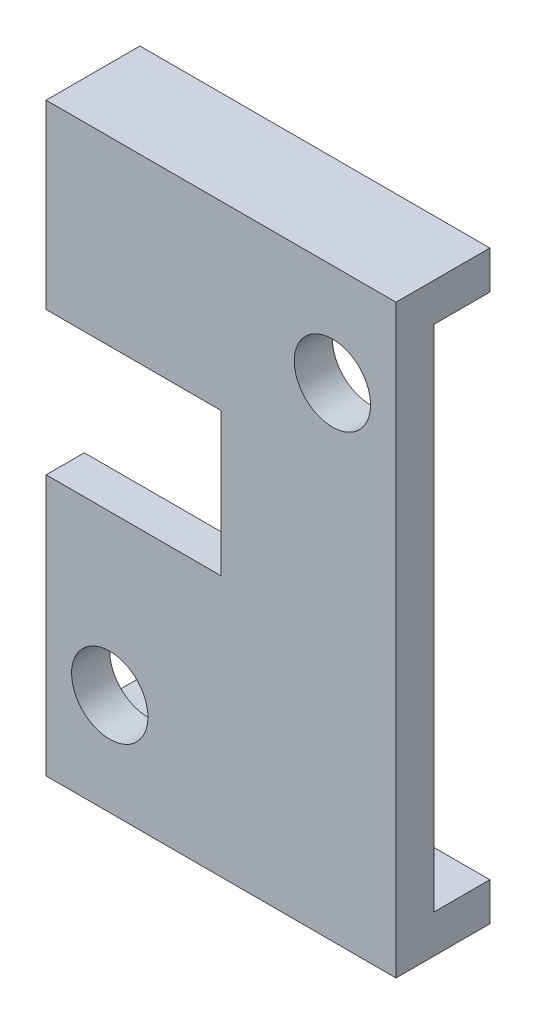
ISO-10303-21;
HEADER;
FILE_DESCRIPTION(('STEP AP214'),'2;1');
FILE_NAME('part.step','',(''),(''),'','','');
FILE_SCHEMA(('AUTOMOTIVE_DESIGN { 1 0 10303 214 1 1 1 1 }'));
ENDSEC;
DATA;
#1=APPLICATION_CONTEXT('core data for automotive mechanical design processes');
#2=APPLICATION_PROTOCOL_DEFINITION('international standard','automotive_design',2000,#1);
#3=PRODUCT_CONTEXT('',#1,'mechanical');
#4=PRODUCT('Part','Part','',(#3));
#5=PRODUCT_RELATED_PRODUCT_CATEGORY('part','',(#4));
#6=PRODUCT_DEFINITION_FORMATION('','',#4);
#7=PRODUCT_DEFINITION_CONTEXT('part definition',#1,'design');
#8=PRODUCT_DEFINITION('design','',#6,#7);
#9=PRODUCT_DEFINITION_SHAPE('','',#8);
#10=(LENGTH_UNIT() NAMED_UNIT(*) SI_UNIT(.MILLI.,.METRE.));
#11=(NAMED_UNIT(*) PLANE_ANGLE_UNIT() SI_UNIT($,.RADIAN.));
#12=(NAMED_UNIT(*) SI_UNIT($,.STERADIAN.) SOLID_ANGLE_UNIT());
#13=UNCERTAINTY_MEASURE_WITH_UNIT(LENGTH_MEASURE(1.E-05),#10,'distance_accuracy_value','');
#14=(GEOMETRIC_REPRESENTATION_CONTEXT(3) GLOBAL_UNCERTAINTY_ASSIGNED_CONTEXT((#13)) GLOBAL_UNIT_ASSIGNED_CONTEXT((#10,
#11,#12)) REPRESENTATION_CONTEXT('',''));
#15=CARTESIAN_POINT('',(0.,0.,0.));
#16=DIRECTION('',(0.,0.,1.));
#17=DIRECTION('',(1.,0.,0.));
#18=AXIS2_PLACEMENT_3D('',#15,#16,#17);
#19=CARTESIAN_POINT('',(0.,0.,0.));
#20=DIRECTION('',(-1.,0.,0.));
#21=DIRECTION('',(0.,0.,1.));
#22=AXIS2_PLACEMENT_3D('',#19,#20,#21);
#23=PLANE('',#22);
#24=DIRECTION('',(0.,0.,-1.));
#25=VECTOR('',#24,1.);
#26=CARTESIAN_POINT('',(0.,8.2,2.95));
#27=LINE('',#26,#25);
#28=CARTESIAN_POINT('',(0.,8.2,2.95));
#29=VERTEX_POINT('',#28);
#30=CARTESIAN_POINT('',(0.,8.2,1.74999999999999));
#31=VERTEX_POINT('',#30);
#32=EDGE_CURVE('E210',#29,#31,#27,.T.);
#33=ORIENTED_EDGE('',*,*,#32,.T.);
#34=DIRECTION('',(0.,1.,0.));
#35=VECTOR('',#34,1.);
#36=CARTESIAN_POINT('',(0.,17.2,1.75));
#37=LINE('',#36,#35);
#38=CARTESIAN_POINT('',(0.,1.2,1.74999999999999));
#39=VERTEX_POINT('',#38);
#40=EDGE_CURVE('E164',#39,#31,#37,.T.);
#41=ORIENTED_EDGE('',*,*,#40,.F.);
#42=DIRECTION('',(0.,0.,1.));
#43=VECTOR('',#42,1.);
#44=CARTESIAN_POINT('',(0.,1.2,1.74999999999999));
#45=LINE('',#44,#43);
#46=CARTESIAN_POINT('',(0.,1.20000000000001,0.));
#47=VERTEX_POINT('',#46);
#48=EDGE_CURVE('E159',#47,#39,#45,.T.);
#49=ORIENTED_EDGE('',*,*,#48,.F.);
#50=DIRECTION('',(0.,1.,0.));
#51=VECTOR('',#50,1.);
#52=CARTESIAN_POINT('',(0.,1.20000000000001,0.));
#53=LINE('',#52,#51);
#54=CARTESIAN_POINT('',(0.,0.,0.));
#55=VERTEX_POINT('',#54);
#56=EDGE_CURVE('E155',#55,#47,#53,.T.);
#57=ORIENTED_EDGE('',*,*,#56,.F.);
#58=DIRECTION('',(0.,0.,-1.));
#59=VECTOR('',#58,1.);
#60=CARTESIAN_POINT('',(0.,0.,0.));
#61=LINE('',#60,#59);
#62=CARTESIAN_POINT('',(0.,0.,2.94999999999999));
#63=VERTEX_POINT('',#62);
#64=EDGE_CURVE('E97',#63,#55,#61,.T.);
#65=ORIENTED_EDGE('',*,*,#64,.F.);
#66=DIRECTION('',(0.,-1.,0.));
#67=VECTOR('',#66,1.);
#68=CARTESIAN_POINT('',(0.,0.,2.94999999999999));
#69=LINE('',#68,#67);
#70=EDGE_CURVE('E176',#29,#63,#69,.T.);
#71=ORIENTED_EDGE('',*,*,#70,.F.);
#72=EDGE_LOOP('',(#33,#41,#49,#57,#65,#71));
#73=FACE_BOUND('',#72,.T.);
#74=ADVANCED_FACE('F39',(#73),#23,.T.);
#75=CARTESIAN_POINT('',(11.,1.20000000000001,0.));
#76=DIRECTION('',(0.,0.,1.));
#77=DIRECTION('',(0.,-1.,0.));
#78=AXIS2_PLACEMENT_3D('',#75,#76,#77);
#79=PLANE('',#78);
#80=ORIENTED_EDGE('',*,*,#56,.T.);
#81=DIRECTION('',(-1.,0.,0.));
#82=VECTOR('',#81,1.);
#83=CARTESIAN_POINT('',(11.,1.20000000000001,0.));
#84=LINE('',#83,#82);
#85=CARTESIAN_POINT('',(11.,1.20000000000001,0.));
#86=VERTEX_POINT('',#85);
#87=EDGE_CURVE('E11',#86,#47,#84,.T.);
#88=ORIENTED_EDGE('',*,*,#87,.F.);
#89=DIRECTION('',(0.,1.,0.));
#90=VECTOR('',#89,1.);
#91=CARTESIAN_POINT('',(11.,1.20000000000001,0.));
#92=LINE('',#91,#90);
#93=CARTESIAN_POINT('',(11.,0.,0.));
#94=VERTEX_POINT('',#93);
#95=EDGE_CURVE('E182',#94,#86,#92,.T.);
#96=ORIENTED_EDGE('',*,*,#95,.F.);
#97=DIRECTION('',(-1.,0.,0.));
#98=VECTOR('',#97,1.);
#99=CARTESIAN_POINT('',(11.,0.,0.));
#100=LINE('',#99,#98);
#101=EDGE_CURVE('E151',#94,#55,#100,.T.);
#102=ORIENTED_EDGE('',*,*,#101,.T.);
#103=EDGE_LOOP('',(#80,#88,#96,#102));
#104=FACE_BOUND('',#103,.T.);
#105=ADVANCED_FACE('F41',(#104),#79,.F.);
#106=CARTESIAN_POINT('',(11.,1.2,1.74999999999999));
#107=DIRECTION('',(0.,-1.,0.));
#108=DIRECTION('',(0.,0.,-1.));
#109=AXIS2_PLACEMENT_3D('',#106,#107,#108);
#110=PLANE('',#109);
#111=ORIENTED_EDGE('',*,*,#48,.T.);
#112=DIRECTION('',(-1.,0.,0.));
#113=VECTOR('',#112,1.);
#114=CARTESIAN_POINT('',(11.,1.2,1.74999999999999));
#115=LINE('',#114,#113);
#116=CARTESIAN_POINT('',(11.,1.2,1.74999999999999));
#117=VERTEX_POINT('',#116);
#118=EDGE_CURVE('E48',#117,#39,#115,.T.);
#119=ORIENTED_EDGE('',*,*,#118,.F.);
#120=DIRECTION('',(0.,0.,1.));
#121=VECTOR('',#120,1.);
#122=CARTESIAN_POINT('',(11.,1.2,1.74999999999999));
#123=LINE('',#122,#121);
#124=EDGE_CURVE('E105',#86,#117,#123,.T.);
#125=ORIENTED_EDGE('',*,*,#124,.F.);
#126=ORIENTED_EDGE('',*,*,#87,.T.);
#127=EDGE_LOOP('',(#111,#119,#125,#126));
#128=FACE_BOUND('',#127,.T.);
#129=ADVANCED_FACE('F318',(#128),#110,.F.);
#130=CARTESIAN_POINT('',(11.,17.2,1.75));
#131=DIRECTION('',(0.,0.,1.));
#132=DIRECTION('',(0.,-1.,0.));
#133=AXIS2_PLACEMENT_3D('',#130,#131,#132);
#134=PLANE('',#133);
#135=CARTESIAN_POINT('',(9.,15.2,1.75));
#136=DIRECTION('',(0.,0.,-1.));
#137=DIRECTION('',(0.,1.,0.));
#138=AXIS2_PLACEMENT_3D('',#135,#136,#137);
#139=CIRCLE('',#138,1.2);
#140=CARTESIAN_POINT('',(9.,16.4,1.75));
#141=VERTEX_POINT('',#140);
#142=EDGE_CURVE('E254',#141,#141,#139,.T.);
#143=ORIENTED_EDGE('',*,*,#142,.F.);
#144=EDGE_LOOP('',(#143));
#145=FACE_BOUND('',#144,.T.);
#146=CARTESIAN_POINT('',(2.,3.2,1.74999999999999));
#147=DIRECTION('',(0.,0.,-1.));
#148=DIRECTION('',(0.,1.,0.));
#149=AXIS2_PLACEMENT_3D('',#146,#147,#148);
#150=CIRCLE('',#149,1.2);
#151=CARTESIAN_POINT('',(2.,4.4,1.74999999999999));
#152=VERTEX_POINT('',#151);
#153=EDGE_CURVE('E218',#152,#152,#150,.T.);
#154=ORIENTED_EDGE('',*,*,#153,.F.);
#155=EDGE_LOOP('',(#154));
#156=FACE_BOUND('',#155,.T.);
#157=ORIENTED_EDGE('',*,*,#40,.T.);
#158=DIRECTION('',(-1.,0.,0.));
#159=VECTOR('',#158,1.);
#160=CARTESIAN_POINT('',(0.,8.2,1.74999999999999));
#161=LINE('',#160,#159);
#162=CARTESIAN_POINT('',(5.5,8.2,1.74999999999999));
#163=VERTEX_POINT('',#162);
#164=EDGE_CURVE('E230',#163,#31,#161,.T.);
#165=ORIENTED_EDGE('',*,*,#164,.F.);
#166=DIRECTION('',(0.,-1.,0.));
#167=VECTOR('',#166,1.);
#168=CARTESIAN_POINT('',(5.5,12.7,1.75));
#169=LINE('',#168,#167);
#170=CARTESIAN_POINT('',(5.5,12.7,1.75));
#171=VERTEX_POINT('',#170);
#172=EDGE_CURVE('E274',#171,#163,#169,.T.);
#173=ORIENTED_EDGE('',*,*,#172,.F.);
#174=DIRECTION('',(1.,0.,0.));
#175=VECTOR('',#174,1.);
#176=CARTESIAN_POINT('',(0.,12.7,1.75));
#177=LINE('',#176,#175);
#178=CARTESIAN_POINT('',(0.,12.7,1.75));
#179=VERTEX_POINT('',#178);
#180=EDGE_CURVE('E271',#179,#171,#177,.T.);
#181=ORIENTED_EDGE('',*,*,#180,.F.);
#182=CARTESIAN_POINT('',(0.,17.2,1.75));
#183=VERTEX_POINT('',#182);
#184=EDGE_CURVE('E163',#179,#183,#37,.T.);
#185=ORIENTED_EDGE('',*,*,#184,.T.);
#186=DIRECTION('',(-1.,0.,0.));
#187=VECTOR('',#186,1.);
#188=CARTESIAN_POINT('',(11.,17.2,1.75));
#189=LINE('',#188,#187);
#190=CARTESIAN_POINT('',(11.,17.2,1.75));
#191=VERTEX_POINT('',#190);
#192=EDGE_CURVE('E193',#191,#183,#189,.T.);
#193=ORIENTED_EDGE('',*,*,#192,.F.);
#194=DIRECTION('',(0.,1.,0.));
#195=VECTOR('',#194,1.);
#196=CARTESIAN_POINT('',(11.,17.2,1.75));
#197=LINE('',#196,#195);
#198=EDGE_CURVE('E204',#117,#191,#197,.T.);
#199=ORIENTED_EDGE('',*,*,#198,.F.);
#200=ORIENTED_EDGE('',*,*,#118,.T.);
#201=EDGE_LOOP('',(#157,#165,#173,#181,#185,#193,#199,#200));
#202=FACE_BOUND('',#201,.T.);
#203=ADVANCED_FACE('F201',(#145,#156,#202),#134,.F.);
#204=CARTESIAN_POINT('',(11.,17.2,0.));
#205=DIRECTION('',(0.,1.,0.));
#206=DIRECTION('',(0.,0.,1.));
#207=AXIS2_PLACEMENT_3D('',#204,#205,#206);
#208=PLANE('',#207);
#209=DIRECTION('',(0.,0.,-1.));
#210=VECTOR('',#209,1.);
#211=CARTESIAN_POINT('',(0.,17.2,0.));
#212=LINE('',#211,#210);
#213=CARTESIAN_POINT('',(0.,17.2,0.));
#214=VERTEX_POINT('',#213);
#215=EDGE_CURVE('E168',#183,#214,#212,.T.);
#216=ORIENTED_EDGE('',*,*,#215,.T.);
#217=DIRECTION('',(-1.,0.,0.));
#218=VECTOR('',#217,1.);
#219=CARTESIAN_POINT('',(11.,17.2,0.));
#220=LINE('',#219,#218);
#221=CARTESIAN_POINT('',(11.,17.2,0.));
#222=VERTEX_POINT('',#221);
#223=EDGE_CURVE('E189',#222,#214,#220,.T.);
#224=ORIENTED_EDGE('',*,*,#223,.F.);
#225=DIRECTION('',(0.,0.,-1.));
#226=VECTOR('',#225,1.);
#227=CARTESIAN_POINT('',(11.,17.2,0.));
#228=LINE('',#227,#226);
#229=EDGE_CURVE('E246',#191,#222,#228,.T.);
#230=ORIENTED_EDGE('',*,*,#229,.F.);
#231=ORIENTED_EDGE('',*,*,#192,.T.);
#232=EDGE_LOOP('',(#216,#224,#230,#231));
#233=FACE_BOUND('',#232,.T.);
#234=ADVANCED_FACE('F301',(#233),#208,.F.);
#235=CARTESIAN_POINT('',(11.,18.4,0.));
#236=DIRECTION('',(0.,0.,1.));
#237=DIRECTION('',(0.,-1.,0.));
#238=AXIS2_PLACEMENT_3D('',#235,#236,#237);
#239=PLANE('',#238);
#240=DIRECTION('',(0.,1.,0.));
#241=VECTOR('',#240,1.);
#242=CARTESIAN_POINT('',(0.,18.4,0.));
#243=LINE('',#242,#241);
#244=CARTESIAN_POINT('',(0.,18.4,0.));
#245=VERTEX_POINT('',#244);
#246=EDGE_CURVE('E171',#214,#245,#243,.T.);
#247=ORIENTED_EDGE('',*,*,#246,.T.);
#248=DIRECTION('',(-1.,0.,0.));
#249=VECTOR('',#248,1.);
#250=CARTESIAN_POINT('',(11.,18.4,0.));
#251=LINE('',#250,#249);
#252=CARTESIAN_POINT('',(11.,18.4,0.));
#253=VERTEX_POINT('',#252);
#254=EDGE_CURVE('E143',#253,#245,#251,.T.);
#255=ORIENTED_EDGE('',*,*,#254,.F.);
#256=DIRECTION('',(0.,1.,0.));
#257=VECTOR('',#256,1.);
#258=CARTESIAN_POINT('',(11.,18.4,0.));
#259=LINE('',#258,#257);
#260=EDGE_CURVE('E128',#222,#253,#259,.T.);
#261=ORIENTED_EDGE('',*,*,#260,.F.);
#262=ORIENTED_EDGE('',*,*,#223,.T.);
#263=EDGE_LOOP('',(#247,#255,#261,#262));
#264=FACE_BOUND('',#263,.T.);
#265=ADVANCED_FACE('F304',(#264),#239,.F.);
#266=CARTESIAN_POINT('',(11.,18.4,2.94999999999999));
#267=DIRECTION('',(0.,-1.,0.));
#268=DIRECTION('',(0.,0.,-1.));
#269=AXIS2_PLACEMENT_3D('',#266,#267,#268);
#270=PLANE('',#269);
#271=DIRECTION('',(0.,0.,1.));
#272=VECTOR('',#271,1.);
#273=CARTESIAN_POINT('',(0.,18.4,2.94999999999999));
#274=LINE('',#273,#272);
#275=CARTESIAN_POINT('',(0.,18.4,2.94999999999999));
#276=VERTEX_POINT('',#275);
#277=EDGE_CURVE('E138',#245,#276,#274,.T.);
#278=ORIENTED_EDGE('',*,*,#277,.T.);
#279=DIRECTION('',(-1.,0.,0.));
#280=VECTOR('',#279,1.);
#281=CARTESIAN_POINT('',(11.,18.4,2.94999999999999));
#282=LINE('',#281,#280);
#283=CARTESIAN_POINT('',(11.,18.4,2.94999999999999));
#284=VERTEX_POINT('',#283);
#285=EDGE_CURVE('E135',#284,#276,#282,.T.);
#286=ORIENTED_EDGE('',*,*,#285,.F.);
#287=DIRECTION('',(0.,0.,1.));
#288=VECTOR('',#287,1.);
#289=CARTESIAN_POINT('',(11.,18.4,2.94999999999999));
#290=LINE('',#289,#288);
#291=EDGE_CURVE('E121',#253,#284,#290,.T.);
#292=ORIENTED_EDGE('',*,*,#291,.F.);
#293=ORIENTED_EDGE('',*,*,#254,.T.);
#294=EDGE_LOOP('',(#278,#286,#292,#293));
#295=FACE_BOUND('',#294,.T.);
#296=ADVANCED_FACE('F136',(#295),#270,.F.);
#297=CARTESIAN_POINT('',(11.,0.,2.94999999999999));
#298=DIRECTION('',(0.,0.,-1.));
#299=DIRECTION('',(0.,1.,0.));
#300=AXIS2_PLACEMENT_3D('',#297,#298,#299);
#301=PLANE('',#300);
#302=CARTESIAN_POINT('',(9.,15.2,2.95));
#303=DIRECTION('',(0.,0.,-1.));
#304=DIRECTION('',(0.,1.,0.));
#305=AXIS2_PLACEMENT_3D('',#302,#303,#304);
#306=CIRCLE('',#305,1.2);
#307=CARTESIAN_POINT('',(9.,16.4,2.95));
#308=VERTEX_POINT('',#307);
#309=EDGE_CURVE('E160',#308,#308,#306,.T.);
#310=ORIENTED_EDGE('',*,*,#309,.T.);
#311=EDGE_LOOP('',(#310));
#312=FACE_BOUND('',#311,.T.);
#313=CARTESIAN_POINT('',(2.,3.2,2.94999999999999));
#314=DIRECTION('',(0.,0.,-1.));
#315=DIRECTION('',(0.,1.,0.));
#316=AXIS2_PLACEMENT_3D('',#313,#314,#315);
#317=CIRCLE('',#316,1.2);
#318=CARTESIAN_POINT('',(2.,4.4,2.94999999999999));
#319=VERTEX_POINT('',#318);
#320=EDGE_CURVE('E224',#319,#319,#317,.T.);
#321=ORIENTED_EDGE('',*,*,#320,.T.);
#322=EDGE_LOOP('',(#321));
#323=FACE_BOUND('',#322,.T.);
#324=DIRECTION('',(0.,-1.,0.));
#325=VECTOR('',#324,1.);
#326=CARTESIAN_POINT('',(5.5,12.7,2.95));
#327=LINE('',#326,#325);
#328=CARTESIAN_POINT('',(5.5,12.7,2.95));
#329=VERTEX_POINT('',#328);
#330=CARTESIAN_POINT('',(5.5,8.2,2.95));
#331=VERTEX_POINT('',#330);
#332=EDGE_CURVE('E266',#329,#331,#327,.T.);
#333=ORIENTED_EDGE('',*,*,#332,.T.);
#334=DIRECTION('',(-1.,0.,0.));
#335=VECTOR('',#334,1.);
#336=CARTESIAN_POINT('',(0.,8.2,2.95));
#337=LINE('',#336,#335);
#338=EDGE_CURVE('E239',#331,#29,#337,.T.);
#339=ORIENTED_EDGE('',*,*,#338,.T.);
#340=ORIENTED_EDGE('',*,*,#70,.T.);
#341=DIRECTION('',(-1.,0.,0.));
#342=VECTOR('',#341,1.);
#343=CARTESIAN_POINT('',(11.,0.,2.94999999999999));
#344=LINE('',#343,#342);
#345=CARTESIAN_POINT('',(11.,0.,2.94999999999999));
#346=VERTEX_POINT('',#345);
#347=EDGE_CURVE('E144',#346,#63,#344,.T.);
#348=ORIENTED_EDGE('',*,*,#347,.F.);
#349=DIRECTION('',(0.,-1.,0.));
#350=VECTOR('',#349,1.);
#351=CARTESIAN_POINT('',(11.,0.,2.94999999999999));
#352=LINE('',#351,#350);
#353=EDGE_CURVE('E125',#284,#346,#352,.T.);
#354=ORIENTED_EDGE('',*,*,#353,.F.);
#355=ORIENTED_EDGE('',*,*,#285,.T.);
#356=CARTESIAN_POINT('',(0.,12.7,2.94999999999999));
#357=VERTEX_POINT('',#356);
#358=EDGE_CURVE('E177',#276,#357,#69,.T.);
#359=ORIENTED_EDGE('',*,*,#358,.T.);
#360=DIRECTION('',(1.,0.,0.));
#361=VECTOR('',#360,1.);
#362=CARTESIAN_POINT('',(0.,12.7,2.95));
#363=LINE('',#362,#361);
#364=EDGE_CURVE('E55',#357,#329,#363,.T.);
#365=ORIENTED_EDGE('',*,*,#364,.T.);
#366=EDGE_LOOP('',(#333,#339,#340,#348,#354,#355,#359,#365));
#367=FACE_BOUND('',#366,.T.);
#368=ADVANCED_FACE('F147',(#312,#323,#367),#301,.F.);
#369=CARTESIAN_POINT('',(11.,0.,0.));
#370=DIRECTION('',(0.,1.,0.));
#371=DIRECTION('',(0.,0.,1.));
#372=AXIS2_PLACEMENT_3D('',#369,#370,#371);
#373=PLANE('',#372);
#374=ORIENTED_EDGE('',*,*,#64,.T.);
#375=ORIENTED_EDGE('',*,*,#101,.F.);
#376=DIRECTION('',(0.,0.,-1.));
#377=VECTOR('',#376,1.);
#378=CARTESIAN_POINT('',(11.,0.,0.));
#379=LINE('',#378,#377);
#380=EDGE_CURVE('E64',#346,#94,#379,.T.);
#381=ORIENTED_EDGE('',*,*,#380,.F.);
#382=ORIENTED_EDGE('',*,*,#347,.T.);
#383=EDGE_LOOP('',(#374,#375,#381,#382));
#384=FACE_BOUND('',#383,.T.);
#385=ADVANCED_FACE('F328',(#384),#373,.F.);
#386=CARTESIAN_POINT('',(11.,0.,0.));
#387=DIRECTION('',(-1.,0.,0.));
#388=DIRECTION('',(0.,0.,1.));
#389=AXIS2_PLACEMENT_3D('',#386,#387,#388);
#390=PLANE('',#389);
#391=ORIENTED_EDGE('',*,*,#95,.T.);
#392=ORIENTED_EDGE('',*,*,#124,.T.);
#393=ORIENTED_EDGE('',*,*,#198,.T.);
#394=ORIENTED_EDGE('',*,*,#229,.T.);
#395=ORIENTED_EDGE('',*,*,#260,.T.);
#396=ORIENTED_EDGE('',*,*,#291,.T.);
#397=ORIENTED_EDGE('',*,*,#353,.T.);
#398=ORIENTED_EDGE('',*,*,#380,.T.);
#399=EDGE_LOOP('',(#391,#392,#393,#394,#395,#396,#397,#398));
#400=FACE_BOUND('',#399,.T.);
#401=ADVANCED_FACE('F123',(#400),#390,.F.);
#402=DIRECTION('',(0.,0.,-1.));
#403=VECTOR('',#402,1.);
#404=CARTESIAN_POINT('',(0.,12.7,2.95));
#405=LINE('',#404,#403);
#406=EDGE_CURVE('E236',#357,#179,#405,.T.);
#407=ORIENTED_EDGE('',*,*,#406,.F.);
#408=ORIENTED_EDGE('',*,*,#358,.F.);
#409=ORIENTED_EDGE('',*,*,#277,.F.);
#410=ORIENTED_EDGE('',*,*,#246,.F.);
#411=ORIENTED_EDGE('',*,*,#215,.F.);
#412=ORIENTED_EDGE('',*,*,#184,.F.);
#413=EDGE_LOOP('',(#407,#408,#409,#410,#411,#412));
#414=FACE_BOUND('',#413,.T.);
#415=ADVANCED_FACE('F295',(#414),#23,.T.);
#416=CARTESIAN_POINT('',(0.,8.2,2.95));
#417=DIRECTION('',(0.,-1.,0.));
#418=DIRECTION('',(0.,0.,-1.));
#419=AXIS2_PLACEMENT_3D('',#416,#417,#418);
#420=PLANE('',#419);
#421=ORIENTED_EDGE('',*,*,#164,.T.);
#422=ORIENTED_EDGE('',*,*,#32,.F.);
#423=ORIENTED_EDGE('',*,*,#338,.F.);
#424=DIRECTION('',(0.,0.,-1.));
#425=VECTOR('',#424,1.);
#426=CARTESIAN_POINT('',(5.5,8.2,2.95));
#427=LINE('',#426,#425);
#428=EDGE_CURVE('E219',#331,#163,#427,.T.);
#429=ORIENTED_EDGE('',*,*,#428,.T.);
#430=EDGE_LOOP('',(#421,#422,#423,#429));
#431=FACE_BOUND('',#430,.T.);
#432=ADVANCED_FACE('F281',(#431),#420,.F.);
#433=CARTESIAN_POINT('',(5.5,12.7,2.95));
#434=DIRECTION('',(1.,0.,0.));
#435=DIRECTION('',(0.,1.,0.));
#436=AXIS2_PLACEMENT_3D('',#433,#434,#435);
#437=PLANE('',#436);
#438=ORIENTED_EDGE('',*,*,#172,.T.);
#439=ORIENTED_EDGE('',*,*,#428,.F.);
#440=ORIENTED_EDGE('',*,*,#332,.F.);
#441=DIRECTION('',(0.,0.,-1.));
#442=VECTOR('',#441,1.);
#443=CARTESIAN_POINT('',(5.5,12.7,2.95));
#444=LINE('',#443,#442);
#445=EDGE_CURVE('E227',#329,#171,#444,.T.);
#446=ORIENTED_EDGE('',*,*,#445,.T.);
#447=EDGE_LOOP('',(#438,#439,#440,#446));
#448=FACE_BOUND('',#447,.T.);
#449=ADVANCED_FACE('F293',(#448),#437,.F.);
#450=CARTESIAN_POINT('',(0.,12.7,2.95));
#451=DIRECTION('',(0.,1.,0.));
#452=DIRECTION('',(0.,0.,1.));
#453=AXIS2_PLACEMENT_3D('',#450,#451,#452);
#454=PLANE('',#453);
#455=ORIENTED_EDGE('',*,*,#180,.T.);
#456=ORIENTED_EDGE('',*,*,#445,.F.);
#457=ORIENTED_EDGE('',*,*,#364,.F.);
#458=ORIENTED_EDGE('',*,*,#406,.T.);
#459=EDGE_LOOP('',(#455,#456,#457,#458));
#460=FACE_BOUND('',#459,.T.);
#461=ADVANCED_FACE('F292',(#460),#454,.F.);
#462=CARTESIAN_POINT('',(2.,3.2,2.94999999999999));
#463=DIRECTION('',(0.,0.,-1.));
#464=DIRECTION('',(0.,1.,0.));
#465=AXIS2_PLACEMENT_3D('',#462,#463,#464);
#466=CYLINDRICAL_SURFACE('',#465,1.2);
#467=ORIENTED_EDGE('',*,*,#320,.F.);
#468=EDGE_LOOP('',(#467));
#469=FACE_BOUND('',#468,.T.);
#470=ORIENTED_EDGE('',*,*,#153,.T.);
#471=EDGE_LOOP('',(#470));
#472=FACE_BOUND('',#471,.T.);
#473=ADVANCED_FACE('F335',(#469,#472),#466,.F.);
#474=CARTESIAN_POINT('',(9.,15.2,2.95));
#475=DIRECTION('',(0.,0.,-1.));
#476=DIRECTION('',(0.,1.,0.));
#477=AXIS2_PLACEMENT_3D('',#474,#475,#476);
#478=CYLINDRICAL_SURFACE('',#477,1.2);
#479=ORIENTED_EDGE('',*,*,#309,.F.);
#480=EDGE_LOOP('',(#479));
#481=FACE_BOUND('',#480,.T.);
#482=ORIENTED_EDGE('',*,*,#142,.T.);
#483=EDGE_LOOP('',(#482));
#484=FACE_BOUND('',#483,.T.);
#485=ADVANCED_FACE('F340',(#481,#484),#478,.F.);
#486=CLOSED_SHELL('',(#74,#105,#129,#203,#234,#265,#296,#368,#385,#401,#415,#432,#449,#461,#473,#485));
#487=MANIFOLD_SOLID_BREP('B2',#486);
#488=ADVANCED_BREP_SHAPE_REPRESENTATION('',(#18,#487),#14);
#489=SHAPE_DEFINITION_REPRESENTATION(#9,#488);
ENDSEC;
END-ISO-10303-21;
